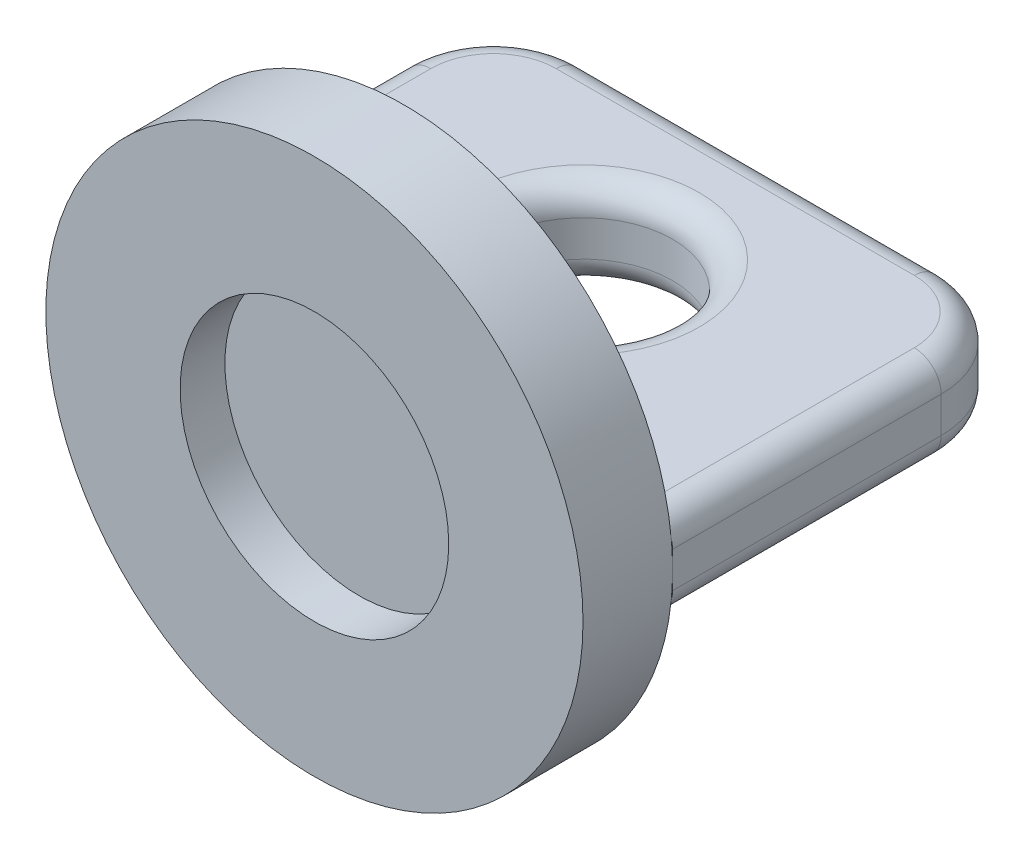
ISO-10303-21;
HEADER;
FILE_DESCRIPTION(('STEP AP214'),'2;1');
FILE_NAME('part.step','',(''),(''),'','','');
FILE_SCHEMA(('AUTOMOTIVE_DESIGN { 1 0 10303 214 1 1 1 1 }'));
ENDSEC;
DATA;
#1=APPLICATION_CONTEXT('core data for automotive mechanical design processes');
#2=APPLICATION_PROTOCOL_DEFINITION('international standard','automotive_design',2000,#1);
#3=PRODUCT_CONTEXT('',#1,'mechanical');
#4=PRODUCT('Part','Part','',(#3));
#5=PRODUCT_RELATED_PRODUCT_CATEGORY('part','',(#4));
#6=PRODUCT_DEFINITION_FORMATION('','',#4);
#7=PRODUCT_DEFINITION_CONTEXT('part definition',#1,'design');
#8=PRODUCT_DEFINITION('design','',#6,#7);
#9=PRODUCT_DEFINITION_SHAPE('','',#8);
#10=(LENGTH_UNIT() NAMED_UNIT(*) SI_UNIT(.MILLI.,.METRE.));
#11=(NAMED_UNIT(*) PLANE_ANGLE_UNIT() SI_UNIT($,.RADIAN.));
#12=(NAMED_UNIT(*) SI_UNIT($,.STERADIAN.) SOLID_ANGLE_UNIT());
#13=UNCERTAINTY_MEASURE_WITH_UNIT(LENGTH_MEASURE(1.E-05),#10,'distance_accuracy_value','');
#14=(GEOMETRIC_REPRESENTATION_CONTEXT(3) GLOBAL_UNCERTAINTY_ASSIGNED_CONTEXT((#13)) GLOBAL_UNIT_ASSIGNED_CONTEXT((#10,
#11,#12)) REPRESENTATION_CONTEXT('',''));
#15=CARTESIAN_POINT('',(0.,0.,0.));
#16=DIRECTION('',(0.,0.,1.));
#17=DIRECTION('',(1.,0.,0.));
#18=AXIS2_PLACEMENT_3D('',#15,#16,#17);
#19=CARTESIAN_POINT('',(0.,0.,0.));
#20=DIRECTION('',(0.,0.,1.));
#21=DIRECTION('',(1.,0.,0.));
#22=AXIS2_PLACEMENT_3D('',#19,#20,#21);
#23=PLANE('',#22);
#24=DIRECTION('',(1.,0.,0.));
#25=VECTOR('',#24,1.);
#26=CARTESIAN_POINT('',(-30.,5.,0.));
#27=LINE('',#26,#25);
#28=CARTESIAN_POINT('',(-27.,5.,0.));
#29=VERTEX_POINT('',#28);
#30=CARTESIAN_POINT('',(27.,5.,0.));
#31=VERTEX_POINT('',#30);
#32=EDGE_CURVE('E151',#29,#31,#27,.T.);
#33=ORIENTED_EDGE('',*,*,#32,.F.);
#34=CARTESIAN_POINT('',(-27.,2.,0.));
#35=DIRECTION('',(0.,0.,1.));
#36=DIRECTION('',(1.,0.,0.));
#37=AXIS2_PLACEMENT_3D('',#34,#35,#36);
#38=CIRCLE('',#37,3.);
#39=CARTESIAN_POINT('',(-29.8584775927309,2.91055249813236,0.));
#40=VERTEX_POINT('',#39);
#41=EDGE_CURVE('E180',#29,#40,#38,.T.);
#42=ORIENTED_EDGE('',*,*,#41,.T.);
#43=CARTESIAN_POINT('',(0.,0.,0.));
#44=DIRECTION('',(0.,0.,1.));
#45=DIRECTION('',(1.,0.,0.));
#46=AXIS2_PLACEMENT_3D('',#43,#44,#45);
#47=CIRCLE('',#46,30.);
#48=CARTESIAN_POINT('',(29.8584775927309,2.9105524981324,0.));
#49=VERTEX_POINT('',#48);
#50=EDGE_CURVE('E64',#49,#40,#47,.T.);
#51=ORIENTED_EDGE('',*,*,#50,.F.);
#52=CARTESIAN_POINT('',(27.,2.,0.));
#53=DIRECTION('',(0.,0.,1.));
#54=DIRECTION('',(1.,0.,0.));
#55=AXIS2_PLACEMENT_3D('',#52,#53,#54);
#56=CIRCLE('',#55,3.);
#57=EDGE_CURVE('E175',#49,#31,#56,.T.);
#58=ORIENTED_EDGE('',*,*,#57,.T.);
#59=EDGE_LOOP('',(#33,#42,#51,#58));
#60=FACE_BOUND('',#59,.T.);
#61=ADVANCED_FACE('F50',(#60),#23,.F.);
#62=CARTESIAN_POINT('',(0.,0.,10.));
#63=DIRECTION('',(0.,0.,-1.));
#64=DIRECTION('',(-1.,0.,0.));
#65=AXIS2_PLACEMENT_3D('',#62,#63,#64);
#66=CYLINDRICAL_SURFACE('',#65,30.);
#67=CARTESIAN_POINT('',(0.,0.,10.));
#68=DIRECTION('',(0.,0.,1.));
#69=DIRECTION('',(1.,0.,0.));
#70=AXIS2_PLACEMENT_3D('',#67,#68,#69);
#71=CIRCLE('',#70,30.);
#72=CARTESIAN_POINT('',(30.,0.,10.));
#73=VERTEX_POINT('',#72);
#74=EDGE_CURVE('E376',#73,#73,#71,.T.);
#75=ORIENTED_EDGE('',*,*,#74,.F.);
#76=EDGE_LOOP('',(#75));
#77=FACE_BOUND('',#76,.T.);
#78=CARTESIAN_POINT('',(30.,0.,0.));
#79=VERTEX_POINT('',#78);
#80=EDGE_CURVE('E406',#79,#49,#47,.T.);
#81=ORIENTED_EDGE('',*,*,#80,.T.);
#82=ORIENTED_EDGE('',*,*,#50,.T.);
#83=CARTESIAN_POINT('',(-30.,0.,0.));
#84=VERTEX_POINT('',#83);
#85=EDGE_CURVE('E408',#40,#84,#47,.T.);
#86=ORIENTED_EDGE('',*,*,#85,.T.);
#87=CARTESIAN_POINT('',(-29.8584775927309,-2.9105524981324,0.));
#88=VERTEX_POINT('',#87);
#89=EDGE_CURVE('E646',#84,#88,#47,.T.);
#90=ORIENTED_EDGE('',*,*,#89,.T.);
#91=CARTESIAN_POINT('',(29.8584775927309,-2.91055249813236,0.));
#92=VERTEX_POINT('',#91);
#93=EDGE_CURVE('E72',#88,#92,#47,.T.);
#94=ORIENTED_EDGE('',*,*,#93,.T.);
#95=EDGE_CURVE('E411',#92,#79,#47,.T.);
#96=ORIENTED_EDGE('',*,*,#95,.T.);
#97=EDGE_LOOP('',(#81,#82,#86,#90,#94,#96));
#98=FACE_BOUND('',#97,.T.);
#99=ADVANCED_FACE('F245',(#77,#98),#66,.T.);
#100=CARTESIAN_POINT('',(0.,0.,10.));
#101=DIRECTION('',(0.,0.,1.));
#102=DIRECTION('',(1.,0.,0.));
#103=AXIS2_PLACEMENT_3D('',#100,#101,#102);
#104=PLANE('',#103);
#105=CARTESIAN_POINT('',(0.,0.,10.));
#106=DIRECTION('',(0.,0.,1.));
#107=DIRECTION('',(1.,0.,0.));
#108=AXIS2_PLACEMENT_3D('',#105,#106,#107);
#109=CIRCLE('',#108,15.);
#110=CARTESIAN_POINT('',(15.,0.,10.));
#111=VERTEX_POINT('',#110);
#112=EDGE_CURVE('E423',#111,#111,#109,.T.);
#113=ORIENTED_EDGE('',*,*,#112,.F.);
#114=EDGE_LOOP('',(#113));
#115=FACE_BOUND('',#114,.T.);
#116=ORIENTED_EDGE('',*,*,#74,.T.);
#117=EDGE_LOOP('',(#116));
#118=FACE_BOUND('',#117,.T.);
#119=ADVANCED_FACE('F252',(#115,#118),#104,.T.);
#120=ORIENTED_EDGE('',*,*,#93,.F.);
#121=CARTESIAN_POINT('',(-27.,-2.,0.));
#122=DIRECTION('',(0.,0.,1.));
#123=DIRECTION('',(1.,0.,0.));
#124=AXIS2_PLACEMENT_3D('',#121,#122,#123);
#125=CIRCLE('',#124,3.);
#126=CARTESIAN_POINT('',(-27.,-5.,0.));
#127=VERTEX_POINT('',#126);
#128=EDGE_CURVE('E172',#88,#127,#125,.T.);
#129=ORIENTED_EDGE('',*,*,#128,.T.);
#130=DIRECTION('',(1.,0.,0.));
#131=VECTOR('',#130,1.);
#132=CARTESIAN_POINT('',(-30.,-5.,0.));
#133=LINE('',#132,#131);
#134=CARTESIAN_POINT('',(27.,-5.,0.));
#135=VERTEX_POINT('',#134);
#136=EDGE_CURVE('E374',#127,#135,#133,.T.);
#137=ORIENTED_EDGE('',*,*,#136,.T.);
#138=CARTESIAN_POINT('',(27.,-2.,0.));
#139=DIRECTION('',(0.,0.,1.));
#140=DIRECTION('',(1.,0.,0.));
#141=AXIS2_PLACEMENT_3D('',#138,#139,#140);
#142=CIRCLE('',#141,3.);
#143=EDGE_CURVE('E166',#135,#92,#142,.T.);
#144=ORIENTED_EDGE('',*,*,#143,.T.);
#145=EDGE_LOOP('',(#120,#129,#137,#144));
#146=FACE_BOUND('',#145,.T.);
#147=ADVANCED_FACE('F250',(#146),#23,.F.);
#148=CARTESIAN_POINT('',(-30.,5.,0.));
#149=DIRECTION('',(0.,0.,-1.));
#150=DIRECTION('',(-1.,0.,0.));
#151=AXIS2_PLACEMENT_3D('',#148,#149,#150);
#152=PLANE('',#151);
#153=ORIENTED_EDGE('',*,*,#85,.F.);
#154=CARTESIAN_POINT('',(-27.,2.,0.));
#155=DIRECTION('',(0.,0.,-1.));
#156=DIRECTION('',(-1.,0.,0.));
#157=AXIS2_PLACEMENT_3D('',#154,#155,#156);
#158=CIRCLE('',#157,3.);
#159=CARTESIAN_POINT('',(-30.,2.,0.));
#160=VERTEX_POINT('',#159);
#161=EDGE_CURVE('E91',#40,#160,#158,.F.);
#162=ORIENTED_EDGE('',*,*,#161,.T.);
#163=DIRECTION('',(0.,-1.,0.));
#164=VECTOR('',#163,1.);
#165=CARTESIAN_POINT('',(-30.,5.,0.));
#166=LINE('',#165,#164);
#167=EDGE_CURVE('E387',#160,#84,#166,.T.);
#168=ORIENTED_EDGE('',*,*,#167,.T.);
#169=EDGE_LOOP('',(#153,#162,#168));
#170=FACE_BOUND('',#169,.T.);
#171=ADVANCED_FACE('F260',(#170),#152,.F.);
#172=CARTESIAN_POINT('',(-30.,-2.,0.));
#173=VERTEX_POINT('',#172);
#174=EDGE_CURVE('E413',#84,#173,#166,.T.);
#175=ORIENTED_EDGE('',*,*,#174,.T.);
#176=CARTESIAN_POINT('',(-27.,-2.,0.));
#177=DIRECTION('',(0.,0.,-1.));
#178=DIRECTION('',(-1.,0.,0.));
#179=AXIS2_PLACEMENT_3D('',#176,#177,#178);
#180=CIRCLE('',#179,3.);
#181=EDGE_CURVE('E357',#173,#88,#180,.F.);
#182=ORIENTED_EDGE('',*,*,#181,.T.);
#183=ORIENTED_EDGE('',*,*,#89,.F.);
#184=EDGE_LOOP('',(#175,#182,#183));
#185=FACE_BOUND('',#184,.T.);
#186=ADVANCED_FACE('F261',(#185),#152,.F.);
#187=DIRECTION('',(0.,-1.,0.));
#188=VECTOR('',#187,1.);
#189=CARTESIAN_POINT('',(30.,5.,0.));
#190=LINE('',#189,#188);
#191=CARTESIAN_POINT('',(30.,2.,0.));
#192=VERTEX_POINT('',#191);
#193=EDGE_CURVE('E296',#192,#79,#190,.T.);
#194=ORIENTED_EDGE('',*,*,#193,.F.);
#195=CARTESIAN_POINT('',(27.,2.,0.));
#196=DIRECTION('',(0.,0.,-1.));
#197=DIRECTION('',(-1.,0.,0.));
#198=AXIS2_PLACEMENT_3D('',#195,#196,#197);
#199=CIRCLE('',#198,3.);
#200=EDGE_CURVE('E153',#192,#49,#199,.F.);
#201=ORIENTED_EDGE('',*,*,#200,.T.);
#202=ORIENTED_EDGE('',*,*,#80,.F.);
#203=EDGE_LOOP('',(#194,#201,#202));
#204=FACE_BOUND('',#203,.T.);
#205=ADVANCED_FACE('F274',(#204),#152,.F.);
#206=CARTESIAN_POINT('',(-30.,5.,0.));
#207=DIRECTION('',(1.,0.,0.));
#208=DIRECTION('',(0.,0.,-1.));
#209=AXIS2_PLACEMENT_3D('',#206,#207,#208);
#210=PLANE('',#209);
#211=DIRECTION('',(0.,-1.,0.));
#212=VECTOR('',#211,1.);
#213=CARTESIAN_POINT('',(-30.,5.,-30.));
#214=LINE('',#213,#212);
#215=CARTESIAN_POINT('',(-30.,2.,-30.));
#216=VERTEX_POINT('',#215);
#217=CARTESIAN_POINT('',(-30.,-2.,-30.));
#218=VERTEX_POINT('',#217);
#219=EDGE_CURVE('E319',#216,#218,#214,.T.);
#220=ORIENTED_EDGE('',*,*,#219,.T.);
#221=DIRECTION('',(0.,0.,1.));
#222=VECTOR('',#221,1.);
#223=CARTESIAN_POINT('',(-30.,-2.,0.));
#224=LINE('',#223,#222);
#225=EDGE_CURVE('E354',#218,#173,#224,.T.);
#226=ORIENTED_EDGE('',*,*,#225,.T.);
#227=ORIENTED_EDGE('',*,*,#174,.F.);
#228=ORIENTED_EDGE('',*,*,#167,.F.);
#229=DIRECTION('',(0.,0.,1.));
#230=VECTOR('',#229,1.);
#231=CARTESIAN_POINT('',(-30.,2.,0.));
#232=LINE('',#231,#230);
#233=EDGE_CURVE('E349',#160,#216,#232,.F.);
#234=ORIENTED_EDGE('',*,*,#233,.T.);
#235=EDGE_LOOP('',(#220,#226,#227,#228,#234));
#236=FACE_BOUND('',#235,.T.);
#237=ADVANCED_FACE('F272',(#236),#210,.F.);
#238=ORIENTED_EDGE('',*,*,#95,.F.);
#239=CARTESIAN_POINT('',(27.,-2.,0.));
#240=DIRECTION('',(0.,0.,-1.));
#241=DIRECTION('',(-1.,0.,0.));
#242=AXIS2_PLACEMENT_3D('',#239,#240,#241);
#243=CIRCLE('',#242,3.);
#244=CARTESIAN_POINT('',(30.,-2.,0.));
#245=VERTEX_POINT('',#244);
#246=EDGE_CURVE('E306',#92,#245,#243,.F.);
#247=ORIENTED_EDGE('',*,*,#246,.T.);
#248=EDGE_CURVE('E200',#79,#245,#190,.T.);
#249=ORIENTED_EDGE('',*,*,#248,.F.);
#250=EDGE_LOOP('',(#238,#247,#249));
#251=FACE_BOUND('',#250,.T.);
#252=ADVANCED_FACE('F263',(#251),#152,.F.);
#253=CARTESIAN_POINT('',(30.,5.,0.));
#254=DIRECTION('',(-1.,0.,0.));
#255=DIRECTION('',(0.,0.,1.));
#256=AXIS2_PLACEMENT_3D('',#253,#254,#255);
#257=PLANE('',#256);
#258=ORIENTED_EDGE('',*,*,#248,.T.);
#259=DIRECTION('',(0.,0.,-1.));
#260=VECTOR('',#259,1.);
#261=CARTESIAN_POINT('',(30.,-2.,-30.));
#262=LINE('',#261,#260);
#263=CARTESIAN_POINT('',(30.,-2.,-30.));
#264=VERTEX_POINT('',#263);
#265=EDGE_CURVE('E295',#245,#264,#262,.T.);
#266=ORIENTED_EDGE('',*,*,#265,.T.);
#267=DIRECTION('',(0.,-1.,0.));
#268=VECTOR('',#267,1.);
#269=CARTESIAN_POINT('',(30.,5.,-30.));
#270=LINE('',#269,#268);
#271=CARTESIAN_POINT('',(30.,2.,-30.));
#272=VERTEX_POINT('',#271);
#273=EDGE_CURVE('E395',#264,#272,#270,.F.);
#274=ORIENTED_EDGE('',*,*,#273,.T.);
#275=DIRECTION('',(0.,0.,-1.));
#276=VECTOR('',#275,1.);
#277=CARTESIAN_POINT('',(30.,2.,0.));
#278=LINE('',#277,#276);
#279=EDGE_CURVE('E134',#272,#192,#278,.F.);
#280=ORIENTED_EDGE('',*,*,#279,.T.);
#281=ORIENTED_EDGE('',*,*,#193,.T.);
#282=EDGE_LOOP('',(#258,#266,#274,#280,#281));
#283=FACE_BOUND('',#282,.T.);
#284=ADVANCED_FACE('F238',(#283),#257,.F.);
#285=CARTESIAN_POINT('',(-30.,5.,-40.));
#286=DIRECTION('',(0.,0.,1.));
#287=DIRECTION('',(1.,0.,0.));
#288=AXIS2_PLACEMENT_3D('',#285,#286,#287);
#289=PLANE('',#288);
#290=DIRECTION('',(0.,-1.,0.));
#291=VECTOR('',#290,1.);
#292=CARTESIAN_POINT('',(20.,5.,-40.));
#293=LINE('',#292,#291);
#294=CARTESIAN_POINT('',(20.,2.,-40.));
#295=VERTEX_POINT('',#294);
#296=CARTESIAN_POINT('',(20.,-2.,-40.));
#297=VERTEX_POINT('',#296);
#298=EDGE_CURVE('E399',#295,#297,#293,.T.);
#299=ORIENTED_EDGE('',*,*,#298,.T.);
#300=DIRECTION('',(-1.,0.,0.));
#301=VECTOR('',#300,1.);
#302=CARTESIAN_POINT('',(-20.,-2.,-40.));
#303=LINE('',#302,#301);
#304=CARTESIAN_POINT('',(-20.,-2.,-40.));
#305=VERTEX_POINT('',#304);
#306=EDGE_CURVE('E167',#297,#305,#303,.T.);
#307=ORIENTED_EDGE('',*,*,#306,.T.);
#308=DIRECTION('',(0.,-1.,0.));
#309=VECTOR('',#308,1.);
#310=CARTESIAN_POINT('',(-20.,5.,-40.));
#311=LINE('',#310,#309);
#312=CARTESIAN_POINT('',(-20.,2.,-40.));
#313=VERTEX_POINT('',#312);
#314=EDGE_CURVE('E401',#305,#313,#311,.F.);
#315=ORIENTED_EDGE('',*,*,#314,.T.);
#316=DIRECTION('',(-1.,0.,0.));
#317=VECTOR('',#316,1.);
#318=CARTESIAN_POINT('',(-30.,2.,-40.));
#319=LINE('',#318,#317);
#320=EDGE_CURVE('E165',#313,#295,#319,.F.);
#321=ORIENTED_EDGE('',*,*,#320,.T.);
#322=EDGE_LOOP('',(#299,#307,#315,#321));
#323=FACE_BOUND('',#322,.T.);
#324=ADVANCED_FACE('F230',(#323),#289,.F.);
#325=CARTESIAN_POINT('',(0.,5.,0.));
#326=DIRECTION('',(0.,-1.,0.));
#327=DIRECTION('',(0.,0.,-1.));
#328=AXIS2_PLACEMENT_3D('',#325,#326,#327);
#329=PLANE('',#328);
#330=CARTESIAN_POINT('',(0.,5.,-20.));
#331=DIRECTION('',(0.,-1.,0.));
#332=DIRECTION('',(0.,0.,-1.));
#333=AXIS2_PLACEMENT_3D('',#330,#331,#332);
#334=CIRCLE('',#333,13.);
#335=CARTESIAN_POINT('',(0.,5.,-33.));
#336=VERTEX_POINT('',#335);
#337=EDGE_CURVE('E185',#336,#336,#334,.T.);
#338=ORIENTED_EDGE('',*,*,#337,.T.);
#339=EDGE_LOOP('',(#338));
#340=FACE_BOUND('',#339,.T.);
#341=ORIENTED_EDGE('',*,*,#32,.T.);
#342=DIRECTION('',(0.,0.,-1.));
#343=VECTOR('',#342,1.);
#344=CARTESIAN_POINT('',(27.,5.,0.));
#345=LINE('',#344,#343);
#346=CARTESIAN_POINT('',(27.,5.,-30.));
#347=VERTEX_POINT('',#346);
#348=EDGE_CURVE('E128',#31,#347,#345,.T.);
#349=ORIENTED_EDGE('',*,*,#348,.T.);
#350=CARTESIAN_POINT('',(20.,5.,-30.));
#351=DIRECTION('',(0.,-1.,0.));
#352=DIRECTION('',(0.,0.,-1.));
#353=AXIS2_PLACEMENT_3D('',#350,#351,#352);
#354=CIRCLE('',#353,7.);
#355=CARTESIAN_POINT('',(20.,5.,-37.));
#356=VERTEX_POINT('',#355);
#357=EDGE_CURVE('E143',#347,#356,#354,.F.);
#358=ORIENTED_EDGE('',*,*,#357,.T.);
#359=DIRECTION('',(-1.,0.,0.));
#360=VECTOR('',#359,1.);
#361=CARTESIAN_POINT('',(0.,5.,-37.));
#362=LINE('',#361,#360);
#363=CARTESIAN_POINT('',(-20.,5.,-37.));
#364=VERTEX_POINT('',#363);
#365=EDGE_CURVE('E368',#356,#364,#362,.T.);
#366=ORIENTED_EDGE('',*,*,#365,.T.);
#367=CARTESIAN_POINT('',(-20.,5.,-30.));
#368=DIRECTION('',(0.,-1.,0.));
#369=DIRECTION('',(0.,0.,-1.));
#370=AXIS2_PLACEMENT_3D('',#367,#368,#369);
#371=CIRCLE('',#370,7.);
#372=CARTESIAN_POINT('',(-27.,5.,-30.));
#373=VERTEX_POINT('',#372);
#374=EDGE_CURVE('E117',#364,#373,#371,.F.);
#375=ORIENTED_EDGE('',*,*,#374,.T.);
#376=DIRECTION('',(0.,0.,1.));
#377=VECTOR('',#376,1.);
#378=CARTESIAN_POINT('',(-27.,5.,0.));
#379=LINE('',#378,#377);
#380=EDGE_CURVE('E148',#373,#29,#379,.T.);
#381=ORIENTED_EDGE('',*,*,#380,.T.);
#382=EDGE_LOOP('',(#341,#349,#358,#366,#375,#381));
#383=FACE_BOUND('',#382,.T.);
#384=ADVANCED_FACE('F149',(#340,#383),#329,.F.);
#385=CARTESIAN_POINT('',(0.,-5.,0.));
#386=DIRECTION('',(0.,-1.,0.));
#387=DIRECTION('',(0.,0.,-1.));
#388=AXIS2_PLACEMENT_3D('',#385,#386,#387);
#389=PLANE('',#388);
#390=CARTESIAN_POINT('',(0.,-5.,-20.));
#391=DIRECTION('',(0.,-1.,0.));
#392=DIRECTION('',(0.,0.,-1.));
#393=AXIS2_PLACEMENT_3D('',#390,#391,#392);
#394=CIRCLE('',#393,13.);
#395=CARTESIAN_POINT('',(0.,-5.,-33.));
#396=VERTEX_POINT('',#395);
#397=EDGE_CURVE('E11',#396,#396,#394,.F.);
#398=ORIENTED_EDGE('',*,*,#397,.T.);
#399=EDGE_LOOP('',(#398));
#400=FACE_BOUND('',#399,.T.);
#401=CARTESIAN_POINT('',(20.,-5.,-30.));
#402=DIRECTION('',(0.,-1.,0.));
#403=DIRECTION('',(0.,0.,-1.));
#404=AXIS2_PLACEMENT_3D('',#401,#402,#403);
#405=CIRCLE('',#404,7.);
#406=CARTESIAN_POINT('',(20.,-5.,-37.));
#407=VERTEX_POINT('',#406);
#408=CARTESIAN_POINT('',(27.,-5.,-30.));
#409=VERTEX_POINT('',#408);
#410=EDGE_CURVE('E332',#407,#409,#405,.T.);
#411=ORIENTED_EDGE('',*,*,#410,.T.);
#412=DIRECTION('',(0.,0.,-1.));
#413=VECTOR('',#412,1.);
#414=CARTESIAN_POINT('',(27.,-5.,0.));
#415=LINE('',#414,#413);
#416=EDGE_CURVE('E333',#409,#135,#415,.F.);
#417=ORIENTED_EDGE('',*,*,#416,.T.);
#418=ORIENTED_EDGE('',*,*,#136,.F.);
#419=DIRECTION('',(0.,0.,1.));
#420=VECTOR('',#419,1.);
#421=CARTESIAN_POINT('',(-27.,-5.,-30.));
#422=LINE('',#421,#420);
#423=CARTESIAN_POINT('',(-27.,-5.,-30.));
#424=VERTEX_POINT('',#423);
#425=EDGE_CURVE('E330',#127,#424,#422,.F.);
#426=ORIENTED_EDGE('',*,*,#425,.T.);
#427=CARTESIAN_POINT('',(-20.,-5.,-30.));
#428=DIRECTION('',(0.,-1.,0.));
#429=DIRECTION('',(0.,0.,-1.));
#430=AXIS2_PLACEMENT_3D('',#427,#428,#429);
#431=CIRCLE('',#430,7.);
#432=CARTESIAN_POINT('',(-20.,-5.,-37.));
#433=VERTEX_POINT('',#432);
#434=EDGE_CURVE('E318',#424,#433,#431,.T.);
#435=ORIENTED_EDGE('',*,*,#434,.T.);
#436=DIRECTION('',(-1.,0.,0.));
#437=VECTOR('',#436,1.);
#438=CARTESIAN_POINT('',(20.,-5.,-37.));
#439=LINE('',#438,#437);
#440=EDGE_CURVE('E311',#433,#407,#439,.F.);
#441=ORIENTED_EDGE('',*,*,#440,.T.);
#442=EDGE_LOOP('',(#411,#417,#418,#426,#435,#441));
#443=FACE_BOUND('',#442,.T.);
#444=ADVANCED_FACE('F228',(#400,#443),#389,.T.);
#445=CARTESIAN_POINT('',(20.,5.,-30.));
#446=DIRECTION('',(0.,-1.,0.));
#447=DIRECTION('',(0.,0.,-1.));
#448=AXIS2_PLACEMENT_3D('',#445,#446,#447);
#449=CYLINDRICAL_SURFACE('',#448,10.);
#450=ORIENTED_EDGE('',*,*,#273,.F.);
#451=CARTESIAN_POINT('',(20.,-2.,-30.));
#452=DIRECTION('',(0.,-1.,0.));
#453=DIRECTION('',(0.,0.,-1.));
#454=AXIS2_PLACEMENT_3D('',#451,#452,#453);
#455=CIRCLE('',#454,10.);
#456=EDGE_CURVE('E343',#264,#297,#455,.F.);
#457=ORIENTED_EDGE('',*,*,#456,.T.);
#458=ORIENTED_EDGE('',*,*,#298,.F.);
#459=CARTESIAN_POINT('',(20.,2.,-30.));
#460=DIRECTION('',(0.,-1.,0.));
#461=DIRECTION('',(0.,0.,-1.));
#462=AXIS2_PLACEMENT_3D('',#459,#460,#461);
#463=CIRCLE('',#462,10.);
#464=EDGE_CURVE('E342',#295,#272,#463,.T.);
#465=ORIENTED_EDGE('',*,*,#464,.T.);
#466=EDGE_LOOP('',(#450,#457,#458,#465));
#467=FACE_BOUND('',#466,.T.);
#468=ADVANCED_FACE('F237',(#467),#449,.T.);
#469=CARTESIAN_POINT('',(-20.,5.,-30.));
#470=DIRECTION('',(0.,-1.,0.));
#471=DIRECTION('',(0.,0.,-1.));
#472=AXIS2_PLACEMENT_3D('',#469,#470,#471);
#473=CYLINDRICAL_SURFACE('',#472,10.);
#474=ORIENTED_EDGE('',*,*,#314,.F.);
#475=CARTESIAN_POINT('',(-20.,-2.,-30.));
#476=DIRECTION('',(0.,-1.,0.));
#477=DIRECTION('',(0.,0.,-1.));
#478=AXIS2_PLACEMENT_3D('',#475,#476,#477);
#479=CIRCLE('',#478,10.);
#480=EDGE_CURVE('E362',#305,#218,#479,.F.);
#481=ORIENTED_EDGE('',*,*,#480,.T.);
#482=ORIENTED_EDGE('',*,*,#219,.F.);
#483=CARTESIAN_POINT('',(-20.,2.,-30.));
#484=DIRECTION('',(0.,-1.,0.));
#485=DIRECTION('',(0.,0.,-1.));
#486=AXIS2_PLACEMENT_3D('',#483,#484,#485);
#487=CIRCLE('',#486,10.);
#488=EDGE_CURVE('E356',#216,#313,#487,.T.);
#489=ORIENTED_EDGE('',*,*,#488,.T.);
#490=EDGE_LOOP('',(#474,#481,#482,#489));
#491=FACE_BOUND('',#490,.T.);
#492=ADVANCED_FACE('F391',(#491),#473,.T.);
#493=CARTESIAN_POINT('',(-27.,-2.,0.));
#494=DIRECTION('',(0.,0.,-1.));
#495=DIRECTION('',(-1.,0.,0.));
#496=AXIS2_PLACEMENT_3D('',#493,#494,#495);
#497=CYLINDRICAL_SURFACE('',#496,3.);
#498=ORIENTED_EDGE('',*,*,#181,.F.);
#499=ORIENTED_EDGE('',*,*,#225,.F.);
#500=CARTESIAN_POINT('',(-27.,-2.,-30.));
#501=DIRECTION('',(0.,0.,-1.));
#502=DIRECTION('',(-1.,0.,0.));
#503=AXIS2_PLACEMENT_3D('',#500,#501,#502);
#504=CIRCLE('',#503,3.);
#505=EDGE_CURVE('E198',#424,#218,#504,.T.);
#506=ORIENTED_EDGE('',*,*,#505,.F.);
#507=ORIENTED_EDGE('',*,*,#425,.F.);
#508=ORIENTED_EDGE('',*,*,#128,.F.);
#509=EDGE_LOOP('',(#498,#499,#506,#507,#508));
#510=FACE_BOUND('',#509,.T.);
#511=ADVANCED_FACE('F544',(#510),#497,.T.);
#512=CARTESIAN_POINT('',(-20.,-2.,-30.));
#513=DIRECTION('',(0.,-1.,0.));
#514=DIRECTION('',(0.,0.,-1.));
#515=AXIS2_PLACEMENT_3D('',#512,#513,#514);
#516=TOROIDAL_SURFACE('',#515,7.,3.);
#517=ORIENTED_EDGE('',*,*,#505,.T.);
#518=ORIENTED_EDGE('',*,*,#480,.F.);
#519=CARTESIAN_POINT('',(-20.,-2.,-37.));
#520=DIRECTION('',(1.,0.,0.));
#521=DIRECTION('',(0.,0.,-1.));
#522=AXIS2_PLACEMENT_3D('',#519,#520,#521);
#523=CIRCLE('',#522,3.);
#524=EDGE_CURVE('E194',#433,#305,#523,.T.);
#525=ORIENTED_EDGE('',*,*,#524,.F.);
#526=ORIENTED_EDGE('',*,*,#434,.F.);
#527=EDGE_LOOP('',(#517,#518,#525,#526));
#528=FACE_BOUND('',#527,.T.);
#529=ADVANCED_FACE('F536',(#528),#516,.T.);
#530=CARTESIAN_POINT('',(-30.,-2.,-37.));
#531=DIRECTION('',(1.,0.,0.));
#532=DIRECTION('',(0.,0.,-1.));
#533=AXIS2_PLACEMENT_3D('',#530,#531,#532);
#534=CYLINDRICAL_SURFACE('',#533,3.);
#535=ORIENTED_EDGE('',*,*,#524,.T.);
#536=ORIENTED_EDGE('',*,*,#306,.F.);
#537=CARTESIAN_POINT('',(20.,-2.,-37.));
#538=DIRECTION('',(1.,0.,0.));
#539=DIRECTION('',(0.,0.,-1.));
#540=AXIS2_PLACEMENT_3D('',#537,#538,#539);
#541=CIRCLE('',#540,3.);
#542=EDGE_CURVE('E187',#407,#297,#541,.T.);
#543=ORIENTED_EDGE('',*,*,#542,.F.);
#544=ORIENTED_EDGE('',*,*,#440,.F.);
#545=EDGE_LOOP('',(#535,#536,#543,#544));
#546=FACE_BOUND('',#545,.T.);
#547=ADVANCED_FACE('F528',(#546),#534,.T.);
#548=CARTESIAN_POINT('',(20.,-2.,-30.));
#549=DIRECTION('',(0.,-1.,0.));
#550=DIRECTION('',(0.,0.,-1.));
#551=AXIS2_PLACEMENT_3D('',#548,#549,#550);
#552=TOROIDAL_SURFACE('',#551,7.,3.);
#553=ORIENTED_EDGE('',*,*,#542,.T.);
#554=ORIENTED_EDGE('',*,*,#456,.F.);
#555=CARTESIAN_POINT('',(27.,-2.,-30.));
#556=DIRECTION('',(0.,0.,1.));
#557=DIRECTION('',(1.,0.,0.));
#558=AXIS2_PLACEMENT_3D('',#555,#556,#557);
#559=CIRCLE('',#558,3.);
#560=EDGE_CURVE('E181',#409,#264,#559,.T.);
#561=ORIENTED_EDGE('',*,*,#560,.F.);
#562=ORIENTED_EDGE('',*,*,#410,.F.);
#563=EDGE_LOOP('',(#553,#554,#561,#562));
#564=FACE_BOUND('',#563,.T.);
#565=ADVANCED_FACE('F517',(#564),#552,.T.);
#566=CARTESIAN_POINT('',(27.,-2.,0.));
#567=DIRECTION('',(0.,0.,1.));
#568=DIRECTION('',(1.,0.,0.));
#569=AXIS2_PLACEMENT_3D('',#566,#567,#568);
#570=CYLINDRICAL_SURFACE('',#569,3.);
#571=ORIENTED_EDGE('',*,*,#143,.F.);
#572=ORIENTED_EDGE('',*,*,#416,.F.);
#573=ORIENTED_EDGE('',*,*,#560,.T.);
#574=ORIENTED_EDGE('',*,*,#265,.F.);
#575=ORIENTED_EDGE('',*,*,#246,.F.);
#576=EDGE_LOOP('',(#571,#572,#573,#574,#575));
#577=FACE_BOUND('',#576,.T.);
#578=ADVANCED_FACE('F307',(#577),#570,.T.);
#579=CARTESIAN_POINT('',(-27.,2.,0.));
#580=DIRECTION('',(0.,0.,1.));
#581=DIRECTION('',(1.,0.,0.));
#582=AXIS2_PLACEMENT_3D('',#579,#580,#581);
#583=CYLINDRICAL_SURFACE('',#582,3.);
#584=ORIENTED_EDGE('',*,*,#41,.F.);
#585=ORIENTED_EDGE('',*,*,#380,.F.);
#586=CARTESIAN_POINT('',(-27.,2.,-30.));
#587=DIRECTION('',(0.,0.,-1.));
#588=DIRECTION('',(-1.,0.,0.));
#589=AXIS2_PLACEMENT_3D('',#586,#587,#588);
#590=CIRCLE('',#589,3.);
#591=EDGE_CURVE('E189',#216,#373,#590,.T.);
#592=ORIENTED_EDGE('',*,*,#591,.F.);
#593=ORIENTED_EDGE('',*,*,#233,.F.);
#594=ORIENTED_EDGE('',*,*,#161,.F.);
#595=EDGE_LOOP('',(#584,#585,#592,#593,#594));
#596=FACE_BOUND('',#595,.T.);
#597=ADVANCED_FACE('F378',(#596),#583,.T.);
#598=CARTESIAN_POINT('',(-20.,2.,-30.));
#599=DIRECTION('',(0.,-1.,0.));
#600=DIRECTION('',(0.,0.,-1.));
#601=AXIS2_PLACEMENT_3D('',#598,#599,#600);
#602=TOROIDAL_SURFACE('',#601,7.,3.);
#603=ORIENTED_EDGE('',*,*,#591,.T.);
#604=ORIENTED_EDGE('',*,*,#374,.F.);
#605=CARTESIAN_POINT('',(-20.,2.,-37.));
#606=DIRECTION('',(1.,0.,0.));
#607=DIRECTION('',(0.,0.,-1.));
#608=AXIS2_PLACEMENT_3D('',#605,#606,#607);
#609=CIRCLE('',#608,3.);
#610=EDGE_CURVE('E201',#313,#364,#609,.T.);
#611=ORIENTED_EDGE('',*,*,#610,.F.);
#612=ORIENTED_EDGE('',*,*,#488,.F.);
#613=EDGE_LOOP('',(#603,#604,#611,#612));
#614=FACE_BOUND('',#613,.T.);
#615=ADVANCED_FACE('F495',(#614),#602,.T.);
#616=CARTESIAN_POINT('',(0.,2.,-37.));
#617=DIRECTION('',(-1.,0.,0.));
#618=DIRECTION('',(0.,0.,1.));
#619=AXIS2_PLACEMENT_3D('',#616,#617,#618);
#620=CYLINDRICAL_SURFACE('',#619,3.);
#621=ORIENTED_EDGE('',*,*,#610,.T.);
#622=ORIENTED_EDGE('',*,*,#365,.F.);
#623=CARTESIAN_POINT('',(20.,2.,-37.));
#624=DIRECTION('',(1.,0.,0.));
#625=DIRECTION('',(0.,0.,-1.));
#626=AXIS2_PLACEMENT_3D('',#623,#624,#625);
#627=CIRCLE('',#626,3.);
#628=EDGE_CURVE('E139',#295,#356,#627,.T.);
#629=ORIENTED_EDGE('',*,*,#628,.F.);
#630=ORIENTED_EDGE('',*,*,#320,.F.);
#631=EDGE_LOOP('',(#621,#622,#629,#630));
#632=FACE_BOUND('',#631,.T.);
#633=ADVANCED_FACE('F481',(#632),#620,.T.);
#634=CARTESIAN_POINT('',(20.,2.,-30.));
#635=DIRECTION('',(0.,-1.,0.));
#636=DIRECTION('',(0.,0.,-1.));
#637=AXIS2_PLACEMENT_3D('',#634,#635,#636);
#638=TOROIDAL_SURFACE('',#637,7.,3.);
#639=ORIENTED_EDGE('',*,*,#628,.T.);
#640=ORIENTED_EDGE('',*,*,#357,.F.);
#641=CARTESIAN_POINT('',(27.,2.,-30.));
#642=DIRECTION('',(0.,0.,1.));
#643=DIRECTION('',(1.,0.,0.));
#644=AXIS2_PLACEMENT_3D('',#641,#642,#643);
#645=CIRCLE('',#644,3.);
#646=EDGE_CURVE('E121',#272,#347,#645,.T.);
#647=ORIENTED_EDGE('',*,*,#646,.F.);
#648=ORIENTED_EDGE('',*,*,#464,.F.);
#649=EDGE_LOOP('',(#639,#640,#647,#648));
#650=FACE_BOUND('',#649,.T.);
#651=ADVANCED_FACE('F142',(#650),#638,.T.);
#652=CARTESIAN_POINT('',(27.,2.,0.));
#653=DIRECTION('',(0.,0.,-1.));
#654=DIRECTION('',(-1.,0.,0.));
#655=AXIS2_PLACEMENT_3D('',#652,#653,#654);
#656=CYLINDRICAL_SURFACE('',#655,3.);
#657=ORIENTED_EDGE('',*,*,#200,.F.);
#658=ORIENTED_EDGE('',*,*,#279,.F.);
#659=ORIENTED_EDGE('',*,*,#646,.T.);
#660=ORIENTED_EDGE('',*,*,#348,.F.);
#661=ORIENTED_EDGE('',*,*,#57,.F.);
#662=EDGE_LOOP('',(#657,#658,#659,#660,#661));
#663=FACE_BOUND('',#662,.T.);
#664=ADVANCED_FACE('F130',(#663),#656,.T.);
#665=CARTESIAN_POINT('',(0.,0.,5.));
#666=DIRECTION('',(0.,0.,1.));
#667=DIRECTION('',(1.,0.,0.));
#668=AXIS2_PLACEMENT_3D('',#665,#666,#667);
#669=CYLINDRICAL_SURFACE('',#668,15.);
#670=CARTESIAN_POINT('',(0.,0.,5.));
#671=DIRECTION('',(0.,0.,1.));
#672=DIRECTION('',(1.,0.,0.));
#673=AXIS2_PLACEMENT_3D('',#670,#671,#672);
#674=CIRCLE('',#673,15.);
#675=CARTESIAN_POINT('',(15.,0.,5.));
#676=VERTEX_POINT('',#675);
#677=EDGE_CURVE('E140',#676,#676,#674,.T.);
#678=ORIENTED_EDGE('',*,*,#677,.F.);
#679=EDGE_LOOP('',(#678));
#680=FACE_BOUND('',#679,.T.);
#681=ORIENTED_EDGE('',*,*,#112,.T.);
#682=EDGE_LOOP('',(#681));
#683=FACE_BOUND('',#682,.T.);
#684=ADVANCED_FACE('F431',(#680,#683),#669,.F.);
#685=CARTESIAN_POINT('',(0.,0.,5.));
#686=DIRECTION('',(0.,0.,1.));
#687=DIRECTION('',(1.,0.,0.));
#688=AXIS2_PLACEMENT_3D('',#685,#686,#687);
#689=PLANE('',#688);
#690=ORIENTED_EDGE('',*,*,#677,.T.);
#691=EDGE_LOOP('',(#690));
#692=FACE_BOUND('',#691,.T.);
#693=ADVANCED_FACE('F427',(#692),#689,.T.);
#694=CARTESIAN_POINT('',(0.,30.,-20.));
#695=DIRECTION('',(0.,-1.,0.));
#696=DIRECTION('',(0.,0.,-1.));
#697=AXIS2_PLACEMENT_3D('',#694,#695,#696);
#698=CYLINDRICAL_SURFACE('',#697,10.);
#699=CARTESIAN_POINT('',(0.,2.,-20.));
#700=DIRECTION('',(0.,-1.,0.));
#701=DIRECTION('',(0.,0.,-1.));
#702=AXIS2_PLACEMENT_3D('',#699,#700,#701);
#703=CIRCLE('',#702,10.);
#704=CARTESIAN_POINT('',(0.,2.,-30.));
#705=VERTEX_POINT('',#704);
#706=EDGE_CURVE('E57',#705,#705,#703,.F.);
#707=ORIENTED_EDGE('',*,*,#706,.T.);
#708=EDGE_LOOP('',(#707));
#709=FACE_BOUND('',#708,.T.);
#710=CARTESIAN_POINT('',(0.,-2.,-20.));
#711=DIRECTION('',(0.,-1.,0.));
#712=DIRECTION('',(0.,0.,-1.));
#713=AXIS2_PLACEMENT_3D('',#710,#711,#712);
#714=CIRCLE('',#713,10.);
#715=CARTESIAN_POINT('',(0.,-2.,-30.));
#716=VERTEX_POINT('',#715);
#717=EDGE_CURVE('E213',#716,#716,#714,.T.);
#718=ORIENTED_EDGE('',*,*,#717,.T.);
#719=EDGE_LOOP('',(#718));
#720=FACE_BOUND('',#719,.T.);
#721=ADVANCED_FACE('F219',(#709,#720),#698,.F.);
#722=CARTESIAN_POINT('',(0.,2.,-20.));
#723=DIRECTION('',(0.,-1.,0.));
#724=DIRECTION('',(0.,0.,-1.));
#725=AXIS2_PLACEMENT_3D('',#722,#723,#724);
#726=TOROIDAL_SURFACE('',#725,13.,3.);
#727=ORIENTED_EDGE('',*,*,#706,.F.);
#728=EDGE_LOOP('',(#727));
#729=FACE_BOUND('',#728,.T.);
#730=ORIENTED_EDGE('',*,*,#337,.F.);
#731=EDGE_LOOP('',(#730));
#732=FACE_BOUND('',#731,.T.);
#733=ADVANCED_FACE('F224',(#729,#732),#726,.T.);
#734=CARTESIAN_POINT('',(0.,-2.,-20.));
#735=DIRECTION('',(0.,-1.,0.));
#736=DIRECTION('',(0.,0.,-1.));
#737=AXIS2_PLACEMENT_3D('',#734,#735,#736);
#738=TOROIDAL_SURFACE('',#737,13.,3.);
#739=ORIENTED_EDGE('',*,*,#397,.F.);
#740=EDGE_LOOP('',(#739));
#741=FACE_BOUND('',#740,.T.);
#742=ORIENTED_EDGE('',*,*,#717,.F.);
#743=EDGE_LOOP('',(#742));
#744=FACE_BOUND('',#743,.T.);
#745=ADVANCED_FACE('F47',(#741,#744),#738,.T.);
#746=CLOSED_SHELL('',(#61,#99,#119,#147,#171,#186,#205,#237,#252,#284,#324,#384,#444,#468,#492,
#511,#529,#547,#565,#578,#597,#615,#633,#651,#664,#684,#693,#721,#733,#745));
#747=MANIFOLD_SOLID_BREP('B2',#746);
#748=ADVANCED_BREP_SHAPE_REPRESENTATION('',(#18,#747),#14);
#749=SHAPE_DEFINITION_REPRESENTATION(#9,#748);
ENDSEC;
END-ISO-10303-21;
